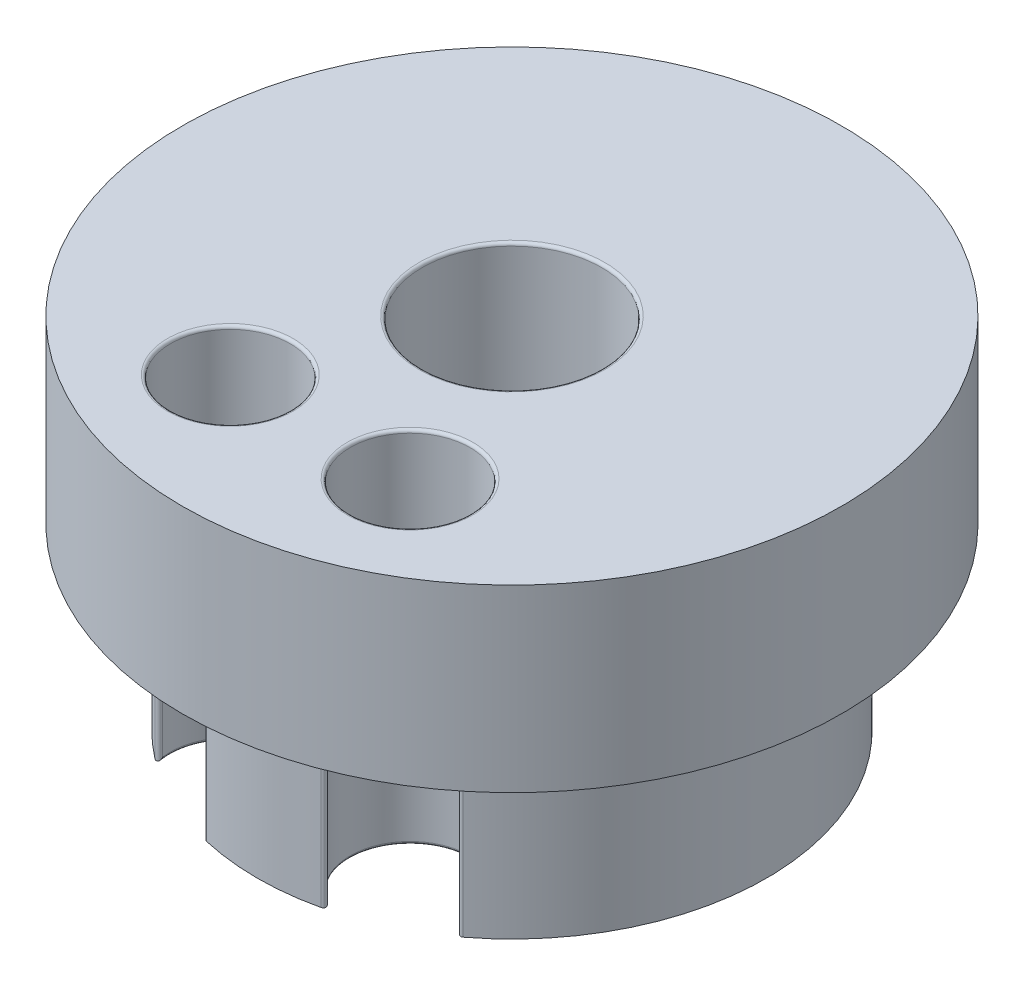
ISO-10303-21;
HEADER;
FILE_DESCRIPTION(('STEP AP214'),'2;1');
FILE_NAME('part.step','',(''),(''),'','','');
FILE_SCHEMA(('AUTOMOTIVE_DESIGN { 1 0 10303 214 1 1 1 1 }'));
ENDSEC;
DATA;
#1=APPLICATION_CONTEXT('core data for automotive mechanical design processes');
#2=APPLICATION_PROTOCOL_DEFINITION('international standard','automotive_design',2000,#1);
#3=PRODUCT_CONTEXT('',#1,'mechanical');
#4=PRODUCT('Part','Part','',(#3));
#5=PRODUCT_RELATED_PRODUCT_CATEGORY('part','',(#4));
#6=PRODUCT_DEFINITION_FORMATION('','',#4);
#7=PRODUCT_DEFINITION_CONTEXT('part definition',#1,'design');
#8=PRODUCT_DEFINITION('design','',#6,#7);
#9=PRODUCT_DEFINITION_SHAPE('','',#8);
#10=(LENGTH_UNIT() NAMED_UNIT(*) SI_UNIT(.MILLI.,.METRE.));
#11=(NAMED_UNIT(*) PLANE_ANGLE_UNIT() SI_UNIT($,.RADIAN.));
#12=(NAMED_UNIT(*) SI_UNIT($,.STERADIAN.) SOLID_ANGLE_UNIT());
#13=UNCERTAINTY_MEASURE_WITH_UNIT(LENGTH_MEASURE(1.E-05),#10,'distance_accuracy_value','');
#14=(GEOMETRIC_REPRESENTATION_CONTEXT(3) GLOBAL_UNCERTAINTY_ASSIGNED_CONTEXT((#13)) GLOBAL_UNIT_ASSIGNED_CONTEXT((#10,
#11,#12)) REPRESENTATION_CONTEXT('',''));
#15=CARTESIAN_POINT('',(0.,0.,0.));
#16=DIRECTION('',(0.,0.,1.));
#17=DIRECTION('',(1.,0.,0.));
#18=AXIS2_PLACEMENT_3D('',#15,#16,#17);
#19=CARTESIAN_POINT('',(0.,-0.6,0.));
#20=DIRECTION('',(0.,1.,0.));
#21=DIRECTION('',(0.,0.,1.));
#22=AXIS2_PLACEMENT_3D('',#19,#20,#21);
#23=CYLINDRICAL_SURFACE('',#22,0.425);
#24=CARTESIAN_POINT('',(0.,-0.3,0.));
#25=DIRECTION('',(0.,-1.,0.));
#26=DIRECTION('',(0.,0.,-1.));
#27=AXIS2_PLACEMENT_3D('',#24,#25,#26);
#28=CIRCLE('',#27,0.425);
#29=CARTESIAN_POINT('',(-0.257018482132162,-0.3,0.338476734566025));
#30=VERTEX_POINT('',#29);
#31=CARTESIAN_POINT('',(0.257018482132162,-0.3,0.338476734566025));
#32=VERTEX_POINT('',#31);
#33=EDGE_CURVE('E314',#30,#32,#28,.T.);
#34=ORIENTED_EDGE('',*,*,#33,.T.);
#35=DIRECTION('',(0.,1.,0.));
#36=VECTOR('',#35,1.);
#37=CARTESIAN_POINT('',(0.257018482132162,-0.6,0.338476734566025));
#38=LINE('',#37,#36);
#39=CARTESIAN_POINT('',(0.257018482132162,-0.6,0.338476734566025));
#40=VERTEX_POINT('',#39);
#41=EDGE_CURVE('E287',#32,#40,#38,.F.);
#42=ORIENTED_EDGE('',*,*,#41,.T.);
#43=CARTESIAN_POINT('',(0.,-0.6,0.));
#44=DIRECTION('',(0.,-1.,0.));
#45=DIRECTION('',(0.,0.,-1.));
#46=AXIS2_PLACEMENT_3D('',#43,#44,#45);
#47=CIRCLE('',#46,0.425);
#48=CARTESIAN_POINT('',(-0.257018482132162,-0.6,0.338476734566025));
#49=VERTEX_POINT('',#48);
#50=EDGE_CURVE('E147',#49,#40,#47,.T.);
#51=ORIENTED_EDGE('',*,*,#50,.F.);
#52=DIRECTION('',(0.,1.,0.));
#53=VECTOR('',#52,1.);
#54=CARTESIAN_POINT('',(-0.257018482132162,-0.6,0.338476734566025));
#55=LINE('',#54,#53);
#56=EDGE_CURVE('E285',#49,#30,#55,.T.);
#57=ORIENTED_EDGE('',*,*,#56,.T.);
#58=EDGE_LOOP('',(#34,#42,#51,#57));
#59=FACE_BOUND('',#58,.T.);
#60=ADVANCED_FACE('F32',(#59),#23,.T.);
#61=CARTESIAN_POINT('',(0.,-0.3,0.));
#62=DIRECTION('',(0.,1.,0.));
#63=DIRECTION('',(0.,0.,1.));
#64=AXIS2_PLACEMENT_3D('',#61,#62,#63);
#65=CYLINDRICAL_SURFACE('',#64,0.55);
#66=CARTESIAN_POINT('',(0.,-0.3,0.));
#67=DIRECTION('',(0.,1.,0.));
#68=DIRECTION('',(0.,0.,1.));
#69=AXIS2_PLACEMENT_3D('',#66,#67,#68);
#70=CIRCLE('',#69,0.55);
#71=CARTESIAN_POINT('',(0.,-0.3,0.55));
#72=VERTEX_POINT('',#71);
#73=EDGE_CURVE('E320',#72,#72,#70,.T.);
#74=ORIENTED_EDGE('',*,*,#73,.T.);
#75=EDGE_LOOP('',(#74));
#76=FACE_BOUND('',#75,.T.);
#77=CARTESIAN_POINT('',(0.,0.,0.));
#78=DIRECTION('',(0.,1.,0.));
#79=DIRECTION('',(0.,0.,1.));
#80=AXIS2_PLACEMENT_3D('',#77,#78,#79);
#81=CIRCLE('',#80,0.55);
#82=CARTESIAN_POINT('',(0.,0.,0.55));
#83=VERTEX_POINT('',#82);
#84=EDGE_CURVE('E146',#83,#83,#81,.T.);
#85=ORIENTED_EDGE('',*,*,#84,.F.);
#86=EDGE_LOOP('',(#85));
#87=FACE_BOUND('',#86,.T.);
#88=ADVANCED_FACE('F344',(#76,#87),#65,.T.);
#89=CARTESIAN_POINT('',(0.,-0.3,0.));
#90=DIRECTION('',(0.,1.,0.));
#91=DIRECTION('',(0.,0.,1.));
#92=AXIS2_PLACEMENT_3D('',#89,#90,#91);
#93=PLANE('',#92);
#94=CARTESIAN_POINT('',(0.0946141518261391,-0.3,0.409204303831497));
#95=DIRECTION('',(0.,1.,0.));
#96=DIRECTION('',(0.,0.,1.));
#97=AXIS2_PLACEMENT_3D('',#94,#95,#96);
#98=CIRCLE('',#97,0.005);
#99=CARTESIAN_POINT('',(0.0957405107764503,-0.3,0.414075783639015));
#100=VERTEX_POINT('',#99);
#101=CARTESIAN_POINT('',(0.098923567361903,-0.3,0.411739838832265));
#102=VERTEX_POINT('',#101);
#103=EDGE_CURVE('E153',#100,#102,#98,.T.);
#104=ORIENTED_EDGE('',*,*,#103,.T.);
#105=CARTESIAN_POINT('',(0.15,-0.3,0.32));
#106=DIRECTION('',(0.,1.,0.));
#107=DIRECTION('',(0.,0.,1.));
#108=AXIS2_PLACEMENT_3D('',#105,#106,#107);
#109=CIRCLE('',#108,0.105);
#110=CARTESIAN_POINT('',(0.253186801406577,-0.3,0.339428947873824));
#111=VERTEX_POINT('',#110);
#112=EDGE_CURVE('E155',#102,#111,#109,.T.);
#113=ORIENTED_EDGE('',*,*,#112,.T.);
#114=CARTESIAN_POINT('',(0.253994735283549,-0.3,0.334494655335836));
#115=DIRECTION('',(0.,1.,0.));
#116=DIRECTION('',(0.,0.,1.));
#117=AXIS2_PLACEMENT_3D('',#114,#115,#116);
#118=CIRCLE('',#117,0.005);
#119=EDGE_CURVE('E174',#111,#32,#118,.T.);
#120=ORIENTED_EDGE('',*,*,#119,.T.);
#121=ORIENTED_EDGE('',*,*,#33,.F.);
#122=CARTESIAN_POINT('',(-0.253994735283549,-0.3,0.334494655335837));
#123=DIRECTION('',(0.,1.,0.));
#124=DIRECTION('',(0.,0.,1.));
#125=AXIS2_PLACEMENT_3D('',#122,#123,#124);
#126=CIRCLE('',#125,0.005);
#127=CARTESIAN_POINT('',(-0.253186801406577,-0.3,0.339428947873824));
#128=VERTEX_POINT('',#127);
#129=EDGE_CURVE('E11',#30,#128,#126,.T.);
#130=ORIENTED_EDGE('',*,*,#129,.T.);
#131=CARTESIAN_POINT('',(-0.15,-0.3,0.32));
#132=DIRECTION('',(0.,1.,0.));
#133=DIRECTION('',(0.,0.,1.));
#134=AXIS2_PLACEMENT_3D('',#131,#132,#133);
#135=CIRCLE('',#134,0.105);
#136=CARTESIAN_POINT('',(-0.0989235673619029,-0.3,0.411739838832265));
#137=VERTEX_POINT('',#136);
#138=EDGE_CURVE('E54',#128,#137,#135,.T.);
#139=ORIENTED_EDGE('',*,*,#138,.T.);
#140=CARTESIAN_POINT('',(-0.0946141518261391,-0.3,0.409204303831497));
#141=DIRECTION('',(0.,1.,0.));
#142=DIRECTION('',(0.,0.,1.));
#143=AXIS2_PLACEMENT_3D('',#140,#141,#142);
#144=CIRCLE('',#143,0.005);
#145=CARTESIAN_POINT('',(-0.0957405107764502,-0.3,0.414075783639015));
#146=VERTEX_POINT('',#145);
#147=EDGE_CURVE('E46',#137,#146,#144,.T.);
#148=ORIENTED_EDGE('',*,*,#147,.T.);
#149=EDGE_CURVE('E312',#100,#146,#28,.T.);
#150=ORIENTED_EDGE('',*,*,#149,.F.);
#151=EDGE_LOOP('',(#104,#113,#120,#121,#130,#139,#148,#150));
#152=FACE_BOUND('',#151,.T.);
#153=ORIENTED_EDGE('',*,*,#73,.F.);
#154=EDGE_LOOP('',(#153));
#155=FACE_BOUND('',#154,.T.);
#156=ADVANCED_FACE('F310',(#152,#155),#93,.F.);
#157=CARTESIAN_POINT('',(0.,0.,0.));
#158=DIRECTION('',(0.,1.,0.));
#159=DIRECTION('',(0.,0.,1.));
#160=AXIS2_PLACEMENT_3D('',#157,#158,#159);
#161=PLANE('',#160);
#162=CARTESIAN_POINT('',(0.,0.,0.));
#163=DIRECTION('',(0.,1.,0.));
#164=DIRECTION('',(0.,0.,1.));
#165=AXIS2_PLACEMENT_3D('',#162,#163,#164);
#166=CIRCLE('',#165,0.155);
#167=CARTESIAN_POINT('',(0.,0.,0.155));
#168=VERTEX_POINT('',#167);
#169=EDGE_CURVE('E334',#168,#168,#166,.F.);
#170=ORIENTED_EDGE('',*,*,#169,.T.);
#171=EDGE_LOOP('',(#170));
#172=FACE_BOUND('',#171,.T.);
#173=CARTESIAN_POINT('',(0.15,0.,0.32));
#174=DIRECTION('',(0.,1.,0.));
#175=DIRECTION('',(0.,0.,1.));
#176=AXIS2_PLACEMENT_3D('',#173,#174,#175);
#177=CIRCLE('',#176,0.105);
#178=CARTESIAN_POINT('',(0.15,0.,0.425));
#179=VERTEX_POINT('',#178);
#180=EDGE_CURVE('E331',#179,#179,#177,.F.);
#181=ORIENTED_EDGE('',*,*,#180,.T.);
#182=EDGE_LOOP('',(#181));
#183=FACE_BOUND('',#182,.T.);
#184=CARTESIAN_POINT('',(-0.15,0.,0.32));
#185=DIRECTION('',(0.,1.,0.));
#186=DIRECTION('',(0.,0.,1.));
#187=AXIS2_PLACEMENT_3D('',#184,#185,#186);
#188=CIRCLE('',#187,0.105);
#189=CARTESIAN_POINT('',(-0.15,0.,0.425));
#190=VERTEX_POINT('',#189);
#191=EDGE_CURVE('E328',#190,#190,#188,.F.);
#192=ORIENTED_EDGE('',*,*,#191,.T.);
#193=EDGE_LOOP('',(#192));
#194=FACE_BOUND('',#193,.T.);
#195=ORIENTED_EDGE('',*,*,#84,.T.);
#196=EDGE_LOOP('',(#195));
#197=FACE_BOUND('',#196,.T.);
#198=ADVANCED_FACE('F354',(#172,#183,#194,#197),#161,.T.);
#199=CARTESIAN_POINT('',(0.0957405107764503,-0.6,0.414075783639015));
#200=VERTEX_POINT('',#199);
#201=CARTESIAN_POINT('',(-0.0957405107764502,-0.6,0.414075783639015));
#202=VERTEX_POINT('',#201);
#203=EDGE_CURVE('E129',#200,#202,#47,.T.);
#204=ORIENTED_EDGE('',*,*,#203,.F.);
#205=DIRECTION('',(0.,1.,0.));
#206=VECTOR('',#205,1.);
#207=CARTESIAN_POINT('',(0.0957405107764503,-0.6,0.414075783639015));
#208=LINE('',#207,#206);
#209=EDGE_CURVE('E142',#200,#100,#208,.T.);
#210=ORIENTED_EDGE('',*,*,#209,.T.);
#211=ORIENTED_EDGE('',*,*,#149,.T.);
#212=DIRECTION('',(0.,1.,0.));
#213=VECTOR('',#212,1.);
#214=CARTESIAN_POINT('',(-0.0957405107764503,-0.6,0.414075783639015));
#215=LINE('',#214,#213);
#216=EDGE_CURVE('E145',#146,#202,#215,.F.);
#217=ORIENTED_EDGE('',*,*,#216,.T.);
#218=EDGE_LOOP('',(#204,#210,#211,#217));
#219=FACE_BOUND('',#218,.T.);
#220=ADVANCED_FACE('F140',(#219),#23,.T.);
#221=CARTESIAN_POINT('',(0.,-0.6,0.));
#222=DIRECTION('',(0.,-1.,0.));
#223=DIRECTION('',(0.,0.,-1.));
#224=AXIS2_PLACEMENT_3D('',#221,#222,#223);
#225=PLANE('',#224);
#226=CARTESIAN_POINT('',(0.,-0.6,0.));
#227=DIRECTION('',(0.,-1.,0.));
#228=DIRECTION('',(0.,0.,-1.));
#229=AXIS2_PLACEMENT_3D('',#226,#227,#228);
#230=CIRCLE('',#229,0.155);
#231=CARTESIAN_POINT('',(0.,-0.6,-0.155));
#232=VERTEX_POINT('',#231);
#233=EDGE_CURVE('E282',#232,#232,#230,.F.);
#234=ORIENTED_EDGE('',*,*,#233,.T.);
#235=EDGE_LOOP('',(#234));
#236=FACE_BOUND('',#235,.T.);
#237=ORIENTED_EDGE('',*,*,#50,.T.);
#238=CARTESIAN_POINT('',(0.253994735283549,-0.6,0.334494655335836));
#239=DIRECTION('',(0.,-1.,0.));
#240=DIRECTION('',(0.,0.,-1.));
#241=AXIS2_PLACEMENT_3D('',#238,#239,#240);
#242=CIRCLE('',#241,0.005);
#243=CARTESIAN_POINT('',(0.253186801406558,-0.6,0.339428947873821));
#244=VERTEX_POINT('',#243);
#245=EDGE_CURVE('E280',#40,#244,#242,.T.);
#246=ORIENTED_EDGE('',*,*,#245,.T.);
#247=CARTESIAN_POINT('',(0.15,-0.6,0.32));
#248=DIRECTION('',(0.,-1.,0.));
#249=DIRECTION('',(0.,0.,-1.));
#250=AXIS2_PLACEMENT_3D('',#247,#248,#249);
#251=CIRCLE('',#250,0.105);
#252=CARTESIAN_POINT('',(0.0989235673619124,-0.6,0.411739838832248));
#253=VERTEX_POINT('',#252);
#254=EDGE_CURVE('E131',#244,#253,#251,.F.);
#255=ORIENTED_EDGE('',*,*,#254,.T.);
#256=CARTESIAN_POINT('',(0.0946141518261391,-0.6,0.409204303831497));
#257=DIRECTION('',(0.,-1.,0.));
#258=DIRECTION('',(0.,0.,-1.));
#259=AXIS2_PLACEMENT_3D('',#256,#257,#258);
#260=CIRCLE('',#259,0.005);
#261=EDGE_CURVE('E125',#253,#200,#260,.T.);
#262=ORIENTED_EDGE('',*,*,#261,.T.);
#263=ORIENTED_EDGE('',*,*,#203,.T.);
#264=CARTESIAN_POINT('',(-0.0946141518261391,-0.6,0.409204303831497));
#265=DIRECTION('',(0.,-1.,0.));
#266=DIRECTION('',(0.,0.,-1.));
#267=AXIS2_PLACEMENT_3D('',#264,#265,#266);
#268=CIRCLE('',#267,0.005);
#269=CARTESIAN_POINT('',(-0.0989235673619123,-0.6,0.411739838832248));
#270=VERTEX_POINT('',#269);
#271=EDGE_CURVE('E136',#202,#270,#268,.T.);
#272=ORIENTED_EDGE('',*,*,#271,.T.);
#273=CARTESIAN_POINT('',(-0.15,-0.6,0.32));
#274=DIRECTION('',(0.,-1.,0.));
#275=DIRECTION('',(0.,0.,-1.));
#276=AXIS2_PLACEMENT_3D('',#273,#274,#275);
#277=CIRCLE('',#276,0.105);
#278=CARTESIAN_POINT('',(-0.253186801406558,-0.6,0.339428947873821));
#279=VERTEX_POINT('',#278);
#280=EDGE_CURVE('E273',#270,#279,#277,.F.);
#281=ORIENTED_EDGE('',*,*,#280,.T.);
#282=CARTESIAN_POINT('',(-0.253994735283549,-0.6,0.334494655335837));
#283=DIRECTION('',(0.,-1.,0.));
#284=DIRECTION('',(0.,0.,-1.));
#285=AXIS2_PLACEMENT_3D('',#282,#283,#284);
#286=CIRCLE('',#285,0.005);
#287=EDGE_CURVE('E275',#279,#49,#286,.T.);
#288=ORIENTED_EDGE('',*,*,#287,.T.);
#289=EDGE_LOOP('',(#237,#246,#255,#262,#263,#272,#281,#288));
#290=FACE_BOUND('',#289,.T.);
#291=ADVANCED_FACE('F128',(#236,#290),#225,.T.);
#292=CARTESIAN_POINT('',(-0.15,-0.6,0.32));
#293=DIRECTION('',(0.,1.,0.));
#294=DIRECTION('',(0.,0.,1.));
#295=AXIS2_PLACEMENT_3D('',#292,#293,#294);
#296=CYLINDRICAL_SURFACE('',#295,0.1);
#297=CARTESIAN_POINT('',(-0.15,-0.595,0.32));
#298=DIRECTION('',(0.,-1.,0.));
#299=DIRECTION('',(0.,0.,-1.));
#300=AXIS2_PLACEMENT_3D('',#297,#298,#299);
#301=CIRCLE('',#300,0.1);
#302=CARTESIAN_POINT('',(-0.249042605031951,-0.595,0.333804433653178));
#303=VERTEX_POINT('',#302);
#304=CARTESIAN_POINT('',(-0.0972515731677516,-0.595,0.404956479839521));
#305=VERTEX_POINT('',#304);
#306=EDGE_CURVE('E169',#303,#305,#301,.T.);
#307=ORIENTED_EDGE('',*,*,#306,.T.);
#308=DIRECTION('',(0.,1.,0.));
#309=VECTOR('',#308,1.);
#310=CARTESIAN_POINT('',(-0.0972515731677516,-0.6,0.404956479839521));
#311=LINE('',#310,#309);
#312=CARTESIAN_POINT('',(-0.0972515731677516,-0.295,0.404956479839521));
#313=VERTEX_POINT('',#312);
#314=EDGE_CURVE('E171',#305,#313,#311,.T.);
#315=ORIENTED_EDGE('',*,*,#314,.T.);
#316=CARTESIAN_POINT('',(-0.15,-0.295,0.32));
#317=DIRECTION('',(0.,1.,0.));
#318=DIRECTION('',(0.,0.,1.));
#319=AXIS2_PLACEMENT_3D('',#316,#317,#318);
#320=CIRCLE('',#319,0.1);
#321=CARTESIAN_POINT('',(-0.249042605031951,-0.295,0.333804433653178));
#322=VERTEX_POINT('',#321);
#323=EDGE_CURVE('E165',#313,#322,#320,.F.);
#324=ORIENTED_EDGE('',*,*,#323,.T.);
#325=DIRECTION('',(0.,1.,0.));
#326=VECTOR('',#325,1.);
#327=CARTESIAN_POINT('',(-0.249042605031951,-0.6,0.333804433653178));
#328=LINE('',#327,#326);
#329=EDGE_CURVE('E167',#322,#303,#328,.F.);
#330=ORIENTED_EDGE('',*,*,#329,.T.);
#331=EDGE_LOOP('',(#307,#315,#324,#330));
#332=FACE_BOUND('',#331,.T.);
#333=CARTESIAN_POINT('',(-0.15,-0.00500000000000001,0.32));
#334=DIRECTION('',(0.,1.,0.));
#335=DIRECTION('',(0.,0.,1.));
#336=AXIS2_PLACEMENT_3D('',#333,#334,#335);
#337=CIRCLE('',#336,0.1);
#338=CARTESIAN_POINT('',(-0.15,-0.00500000000000001,0.42));
#339=VERTEX_POINT('',#338);
#340=EDGE_CURVE('E162',#339,#339,#337,.T.);
#341=ORIENTED_EDGE('',*,*,#340,.T.);
#342=EDGE_LOOP('',(#341));
#343=FACE_BOUND('',#342,.T.);
#344=ADVANCED_FACE('F271',(#332,#343),#296,.F.);
#345=CARTESIAN_POINT('',(0.15,-0.6,0.32));
#346=DIRECTION('',(0.,1.,0.));
#347=DIRECTION('',(0.,0.,1.));
#348=AXIS2_PLACEMENT_3D('',#345,#346,#347);
#349=CYLINDRICAL_SURFACE('',#348,0.1);
#350=CARTESIAN_POINT('',(0.15,-0.595,0.32));
#351=DIRECTION('',(0.,-1.,0.));
#352=DIRECTION('',(0.,0.,-1.));
#353=AXIS2_PLACEMENT_3D('',#350,#351,#352);
#354=CIRCLE('',#353,0.1);
#355=CARTESIAN_POINT('',(0.0972515731677516,-0.595,0.404956479839521));
#356=VERTEX_POINT('',#355);
#357=CARTESIAN_POINT('',(0.249042605031951,-0.595,0.333804433653178));
#358=VERTEX_POINT('',#357);
#359=EDGE_CURVE('E297',#356,#358,#354,.T.);
#360=ORIENTED_EDGE('',*,*,#359,.T.);
#361=DIRECTION('',(0.,1.,0.));
#362=VECTOR('',#361,1.);
#363=CARTESIAN_POINT('',(0.249042605031951,-0.6,0.333804433653178));
#364=LINE('',#363,#362);
#365=CARTESIAN_POINT('',(0.249042605031951,-0.295,0.333804433653178));
#366=VERTEX_POINT('',#365);
#367=EDGE_CURVE('E157',#358,#366,#364,.T.);
#368=ORIENTED_EDGE('',*,*,#367,.T.);
#369=CARTESIAN_POINT('',(0.15,-0.295,0.32));
#370=DIRECTION('',(0.,1.,0.));
#371=DIRECTION('',(0.,0.,1.));
#372=AXIS2_PLACEMENT_3D('',#369,#370,#371);
#373=CIRCLE('',#372,0.1);
#374=CARTESIAN_POINT('',(0.0972515731677516,-0.295,0.404956479839521));
#375=VERTEX_POINT('',#374);
#376=EDGE_CURVE('E293',#366,#375,#373,.F.);
#377=ORIENTED_EDGE('',*,*,#376,.T.);
#378=DIRECTION('',(0.,1.,0.));
#379=VECTOR('',#378,1.);
#380=CARTESIAN_POINT('',(0.0972515731677516,-0.6,0.404956479839521));
#381=LINE('',#380,#379);
#382=EDGE_CURVE('E295',#375,#356,#381,.F.);
#383=ORIENTED_EDGE('',*,*,#382,.T.);
#384=EDGE_LOOP('',(#360,#368,#377,#383));
#385=FACE_BOUND('',#384,.T.);
#386=CARTESIAN_POINT('',(0.15,-0.00500000000000001,0.32));
#387=DIRECTION('',(0.,1.,0.));
#388=DIRECTION('',(0.,0.,1.));
#389=AXIS2_PLACEMENT_3D('',#386,#387,#388);
#390=CIRCLE('',#389,0.1);
#391=CARTESIAN_POINT('',(0.15,-0.00500000000000001,0.42));
#392=VERTEX_POINT('',#391);
#393=EDGE_CURVE('E290',#392,#392,#390,.T.);
#394=ORIENTED_EDGE('',*,*,#393,.T.);
#395=EDGE_LOOP('',(#394));
#396=FACE_BOUND('',#395,.T.);
#397=ADVANCED_FACE('F301',(#385,#396),#349,.F.);
#398=CARTESIAN_POINT('',(0.,-0.6,0.));
#399=DIRECTION('',(0.,1.,0.));
#400=DIRECTION('',(0.,0.,1.));
#401=AXIS2_PLACEMENT_3D('',#398,#399,#400);
#402=CYLINDRICAL_SURFACE('',#401,0.15);
#403=CARTESIAN_POINT('',(0.,-0.00500000000000001,0.));
#404=DIRECTION('',(0.,1.,0.));
#405=DIRECTION('',(0.,0.,1.));
#406=AXIS2_PLACEMENT_3D('',#403,#404,#405);
#407=CIRCLE('',#406,0.15);
#408=CARTESIAN_POINT('',(0.,-0.00500000000000001,0.15));
#409=VERTEX_POINT('',#408);
#410=EDGE_CURVE('E317',#409,#409,#407,.T.);
#411=ORIENTED_EDGE('',*,*,#410,.T.);
#412=EDGE_LOOP('',(#411));
#413=FACE_BOUND('',#412,.T.);
#414=CARTESIAN_POINT('',(0.,-0.595,0.));
#415=DIRECTION('',(0.,-1.,0.));
#416=DIRECTION('',(0.,0.,-1.));
#417=AXIS2_PLACEMENT_3D('',#414,#415,#416);
#418=CIRCLE('',#417,0.15);
#419=CARTESIAN_POINT('',(0.,-0.595,-0.15));
#420=VERTEX_POINT('',#419);
#421=EDGE_CURVE('E313',#420,#420,#418,.T.);
#422=ORIENTED_EDGE('',*,*,#421,.T.);
#423=EDGE_LOOP('',(#422));
#424=FACE_BOUND('',#423,.T.);
#425=ADVANCED_FACE('F370',(#413,#424),#402,.F.);
#426=CARTESIAN_POINT('',(0.,-0.00500000000000001,0.));
#427=DIRECTION('',(0.,1.,0.));
#428=DIRECTION('',(0.,0.,1.));
#429=AXIS2_PLACEMENT_3D('',#426,#427,#428);
#430=TOROIDAL_SURFACE('',#429,0.155,0.005);
#431=ORIENTED_EDGE('',*,*,#169,.F.);
#432=EDGE_LOOP('',(#431));
#433=FACE_BOUND('',#432,.T.);
#434=ORIENTED_EDGE('',*,*,#410,.F.);
#435=EDGE_LOOP('',(#434));
#436=FACE_BOUND('',#435,.T.);
#437=ADVANCED_FACE('F367',(#433,#436),#430,.T.);
#438=CARTESIAN_POINT('',(0.,-0.595,0.));
#439=DIRECTION('',(0.,-1.,0.));
#440=DIRECTION('',(0.,0.,-1.));
#441=AXIS2_PLACEMENT_3D('',#438,#439,#440);
#442=TOROIDAL_SURFACE('',#441,0.155,0.005);
#443=ORIENTED_EDGE('',*,*,#421,.F.);
#444=EDGE_LOOP('',(#443));
#445=FACE_BOUND('',#444,.T.);
#446=ORIENTED_EDGE('',*,*,#233,.F.);
#447=EDGE_LOOP('',(#446));
#448=FACE_BOUND('',#447,.T.);
#449=ADVANCED_FACE('F369',(#445,#448),#442,.T.);
#450=CARTESIAN_POINT('',(0.0946141518261391,-0.6,0.409204303831497));
#451=DIRECTION('',(0.,-1.,0.));
#452=DIRECTION('',(0.,0.,-1.));
#453=AXIS2_PLACEMENT_3D('',#450,#451,#452);
#454=CYLINDRICAL_SURFACE('',#453,0.005);
#455=CARTESIAN_POINT('',(0.098923567361903,-0.6,0.411739838832265));
#456=CARTESIAN_POINT('',(0.099037109724336,-0.600000392207745,0.41154761418431));
#457=CARTESIAN_POINT('',(0.0991368599285213,-0.599985084665027,0.411347891269276));
#458=CARTESIAN_POINT('',(0.0993073404714314,-0.599926125869547,0.410942374430836));
#459=CARTESIAN_POINT('',(0.0993783130137966,-0.599882719515652,0.410736647493203));
#460=CARTESIAN_POINT('',(0.0994916343712273,-0.599770669306673,0.410325015866583));
#461=CARTESIAN_POINT('',(0.0995340549529624,-0.599702089402815,0.410119112935657));
#462=CARTESIAN_POINT('',(0.0995926308857317,-0.599543810960538,0.409711475896804));
#463=CARTESIAN_POINT('',(0.0996087287442989,-0.599454066683705,0.409509751861701));
#464=CARTESIAN_POINT('',(0.0996189923593554,-0.599217525606701,0.409033654994556));
#465=CARTESIAN_POINT('',(0.0996015434437092,-0.599062384425994,0.408763186286473));
#466=CARTESIAN_POINT('',(0.0995279521952226,-0.598728172883134,0.408243138129451));
#467=CARTESIAN_POINT('',(0.0994717281722598,-0.598549052645966,0.407993604032138));
#468=CARTESIAN_POINT('',(0.0992981812602483,-0.598097695535768,0.407420327794458));
#469=CARTESIAN_POINT('',(0.0991652956140825,-0.597817262238015,0.407107793735733));
#470=CARTESIAN_POINT('',(0.0988511052001073,-0.597237087976618,0.406529090077766));
#471=CARTESIAN_POINT('',(0.0986697675598422,-0.596937334009943,0.406262952159506));
#472=CARTESIAN_POINT('',(0.0983272725329193,-0.596417232709087,0.405848398224909));
#473=CARTESIAN_POINT('',(0.0981758921381277,-0.596199489579907,0.405688391991599));
#474=CARTESIAN_POINT('',(0.0978561428176769,-0.595761317549946,0.405391556833281));
#475=CARTESIAN_POINT('',(0.0976878009922906,-0.595540893413182,0.405254691842708));
#476=CARTESIAN_POINT('',(0.0974268034582191,-0.595213424714666,0.405069112014762));
#477=CARTESIAN_POINT('',(0.0973400306121169,-0.595106699264835,0.405011415097238));
#478=CARTESIAN_POINT('',(0.0972515731677516,-0.595,0.404956479839521));
#479=B_SPLINE_CURVE_WITH_KNOTS('',3,(#455,#456,#457,#458,#459,#460,#461,#462,#463,#464,#465,
#466,#467,#468,#469,#470,#471,#472,#473,#474,#475,#476,#477,#478),.UNSPECIFIED.,.F.,.F.,(4,2,2,
2,2,2,2,2,2,2,2,4),(0.,0.000667863385239556,0.00132998289287641,0.00199043185464555,
0.00265232141076456,0.00358401008673457,0.00451766763406952,0.00583187130905368,
0.00714696888499545,0.00807488231615759,0.00900133599344971,0.00944865621162361),.UNSPECIFIED.);
#480=EDGE_CURVE('E219',#356,#253,#479,.F.);
#481=ORIENTED_EDGE('',*,*,#480,.F.);
#482=ORIENTED_EDGE('',*,*,#382,.F.);
#483=CARTESIAN_POINT('',(0.098923567361903,-0.3,0.411739838832265));
#484=CARTESIAN_POINT('',(0.0990371097243361,-0.300000392207745,0.41154761418431));
#485=CARTESIAN_POINT('',(0.0991368599285214,-0.299985084665027,0.411347891269276));
#486=CARTESIAN_POINT('',(0.0993073404714315,-0.299926125869547,0.410942374430836));
#487=CARTESIAN_POINT('',(0.0993783130137966,-0.299882719515652,0.410736647493203));
#488=CARTESIAN_POINT('',(0.0994916343712273,-0.299770669306673,0.410325015866583));
#489=CARTESIAN_POINT('',(0.0995340549529624,-0.299702089402815,0.410119112935657));
#490=CARTESIAN_POINT('',(0.0995926308857317,-0.299543810960538,0.409711475896804));
#491=CARTESIAN_POINT('',(0.0996087287442989,-0.299454066683705,0.409509751861701));
#492=CARTESIAN_POINT('',(0.0996189923593554,-0.299217525606701,0.409033654994556));
#493=CARTESIAN_POINT('',(0.0996015434437092,-0.299062384425994,0.408763186286473));
#494=CARTESIAN_POINT('',(0.0995279521952226,-0.298728172883135,0.408243138129451));
#495=CARTESIAN_POINT('',(0.0994717281722598,-0.298549052645966,0.407993604032138));
#496=CARTESIAN_POINT('',(0.0992981812602483,-0.298097695535768,0.407420327794458));
#497=CARTESIAN_POINT('',(0.0991652956140825,-0.297817262238015,0.407107793735733));
#498=CARTESIAN_POINT('',(0.0988511052001073,-0.297237087976618,0.406529090077766));
#499=CARTESIAN_POINT('',(0.0986697675598421,-0.296937334009943,0.406262952159506));
#500=CARTESIAN_POINT('',(0.0983272725329193,-0.296417232709087,0.405848398224909));
#501=CARTESIAN_POINT('',(0.0981758921381277,-0.296199489579907,0.405688391991599));
#502=CARTESIAN_POINT('',(0.0978561428176769,-0.295761317549946,0.405391556833281));
#503=CARTESIAN_POINT('',(0.0976878009922905,-0.295540893413182,0.405254691842708));
#504=CARTESIAN_POINT('',(0.097426803458219,-0.295213424714667,0.405069112014761));
#505=CARTESIAN_POINT('',(0.0973400306121169,-0.295106699264835,0.405011415097238));
#506=CARTESIAN_POINT('',(0.0972515731677516,-0.295,0.404956479839521));
#507=B_SPLINE_CURVE_WITH_KNOTS('',3,(#483,#484,#485,#486,#487,#488,#489,#490,#491,#492,#493,
#494,#495,#496,#497,#498,#499,#500,#501,#502,#503,#504,#505,#506),.UNSPECIFIED.,.F.,.F.,(4,2,2,
2,2,2,2,2,2,2,2,4),(0.,0.000667863385239623,0.00132998289287642,0.00199043185464557,
0.00265232141076458,0.00358401008673457,0.00451766763406952,0.00583187130905368,
0.00714696888499546,0.00807488231615751,0.00900133599344964,0.0094486562116236),.UNSPECIFIED.);
#508=EDGE_CURVE('E212',#102,#375,#507,.T.);
#509=ORIENTED_EDGE('',*,*,#508,.F.);
#510=ORIENTED_EDGE('',*,*,#103,.F.);
#511=ORIENTED_EDGE('',*,*,#209,.F.);
#512=ORIENTED_EDGE('',*,*,#261,.F.);
#513=EDGE_LOOP('',(#481,#482,#509,#510,#511,#512));
#514=FACE_BOUND('',#513,.T.);
#515=ADVANCED_FACE('F150',(#514),#454,.T.);
#516=CARTESIAN_POINT('',(0.15,-0.295,0.32));
#517=DIRECTION('',(0.,1.,0.));
#518=DIRECTION('',(0.,0.,1.));
#519=AXIS2_PLACEMENT_3D('',#516,#517,#518);
#520=TOROIDAL_SURFACE('',#519,0.105,0.005);
#521=ORIENTED_EDGE('',*,*,#508,.T.);
#522=ORIENTED_EDGE('',*,*,#376,.F.);
#523=CARTESIAN_POINT('',(0.253186801406577,-0.3,0.339428947873824));
#524=CARTESIAN_POINT('',(0.252966420293989,-0.300000392207745,0.339393249854785));
#525=CARTESIAN_POINT('',(0.252749098907619,-0.299985084665027,0.339342154247824));
#526=CARTESIAN_POINT('',(0.252328354216917,-0.299926125869547,0.33921377423764));
#527=CARTESIAN_POINT('',(0.252124827458328,-0.299882719515652,0.339136718847329));
#528=CARTESIAN_POINT('',(0.25173594825405,-0.299770669306673,0.338960493734009));
#529=CARTESIAN_POINT('',(0.251550551249651,-0.299702089402815,0.338861380296584));
#530=CARTESIAN_POINT('',(0.251199763637496,-0.299543810960538,0.338645632419415));
#531=CARTESIAN_POINT('',(0.251034417550471,-0.299454066683705,0.338528960233808));
#532=CARTESIAN_POINT('',(0.250661916653041,-0.299217525606701,0.338232284231891));
#533=CARTESIAN_POINT('',(0.250465192652915,-0.299062384425994,0.338045850719658));
#534=CARTESIAN_POINT('',(0.250112553082698,-0.298728172883135,0.337656606463447));
#535=CARTESIAN_POINT('',(0.249956724628677,-0.298549052645966,0.337453761943193));
#536=CARTESIAN_POINT('',(0.249627115977375,-0.298097695535768,0.336953639645805));
#537=CARTESIAN_POINT('',(0.249471906157447,-0.297817262238015,0.33665157004353));
#538=CARTESIAN_POINT('',(0.249228097213587,-0.297237087976618,0.336039875071448));
#539=CARTESIAN_POINT('',(0.249139543469025,-0.296937334009943,0.335730244702076));
#540=CARTESIAN_POINT('',(0.249040009241081,-0.296417232709087,0.335201802892958));
#541=CARTESIAN_POINT('',(0.249013865887567,-0.296199489579907,0.334983091796549));
#542=CARTESIAN_POINT('',(0.248990261367995,-0.295761317549946,0.33454743876282));
#543=CARTESIAN_POINT('',(0.248992755145044,-0.295540893413182,0.334330494583605));
#544=CARTESIAN_POINT('',(0.249017078919979,-0.295213424714667,0.334011170392061));
#545=CARTESIAN_POINT('',(0.249028241820871,-0.295106699264835,0.333907566093135));
#546=CARTESIAN_POINT('',(0.249042605031951,-0.295,0.333804433653178));
#547=B_SPLINE_CURVE_WITH_KNOTS('',3,(#523,#524,#525,#526,#527,#528,#529,#530,#531,#532,#533,
#534,#535,#536,#537,#538,#539,#540,#541,#542,#543,#544,#545,#546),.UNSPECIFIED.,.F.,.F.,(4,2,2,
2,2,2,2,2,2,2,2,4),(0.,0.000667863385239624,0.00132998289287643,0.00199043185464556,
0.00265232141076455,0.00358401008673456,0.00451766763406955,0.00583187130905373,
0.0071469688849955,0.00807488231615751,0.00900133599344964,0.00944865621162361),.UNSPECIFIED.);
#548=EDGE_CURVE('E187',#111,#366,#547,.T.);
#549=ORIENTED_EDGE('',*,*,#548,.F.);
#550=ORIENTED_EDGE('',*,*,#112,.F.);
#551=EDGE_LOOP('',(#521,#522,#549,#550));
#552=FACE_BOUND('',#551,.T.);
#553=ADVANCED_FACE('F202',(#552),#520,.T.);
#554=CARTESIAN_POINT('',(0.15,-0.595,0.32));
#555=DIRECTION('',(0.,-1.,0.));
#556=DIRECTION('',(0.,0.,-1.));
#557=AXIS2_PLACEMENT_3D('',#554,#555,#556);
#558=TOROIDAL_SURFACE('',#557,0.105,0.005);
#559=ORIENTED_EDGE('',*,*,#480,.T.);
#560=ORIENTED_EDGE('',*,*,#254,.F.);
#561=CARTESIAN_POINT('',(0.253186801406577,-0.6,0.339428947873824));
#562=CARTESIAN_POINT('',(0.252966420293989,-0.600000392207745,0.339393249854785));
#563=CARTESIAN_POINT('',(0.252749098907619,-0.599985084665027,0.339342154247824));
#564=CARTESIAN_POINT('',(0.252328354216917,-0.599926125869547,0.33921377423764));
#565=CARTESIAN_POINT('',(0.252124827458328,-0.599882719515652,0.339136718847329));
#566=CARTESIAN_POINT('',(0.25173594825405,-0.599770669306673,0.338960493734009));
#567=CARTESIAN_POINT('',(0.251550551249651,-0.599702089402815,0.338861380296584));
#568=CARTESIAN_POINT('',(0.251199763637496,-0.599543810960538,0.338645632419415));
#569=CARTESIAN_POINT('',(0.251034417550471,-0.599454066683705,0.338528960233808));
#570=CARTESIAN_POINT('',(0.250661916653041,-0.599217525606701,0.338232284231891));
#571=CARTESIAN_POINT('',(0.250465192652915,-0.599062384425994,0.338045850719658));
#572=CARTESIAN_POINT('',(0.250112553082698,-0.598728172883134,0.337656606463447));
#573=CARTESIAN_POINT('',(0.249956724628677,-0.598549052645966,0.337453761943193));
#574=CARTESIAN_POINT('',(0.249627115977375,-0.598097695535768,0.336953639645805));
#575=CARTESIAN_POINT('',(0.249471906157447,-0.597817262238015,0.33665157004353));
#576=CARTESIAN_POINT('',(0.249228097213587,-0.597237087976618,0.336039875071448));
#577=CARTESIAN_POINT('',(0.249139543469025,-0.596937334009943,0.335730244702076));
#578=CARTESIAN_POINT('',(0.249040009241081,-0.596417232709087,0.335201802892958));
#579=CARTESIAN_POINT('',(0.249013865887567,-0.596199489579907,0.334983091796549));
#580=CARTESIAN_POINT('',(0.248990261367995,-0.595761317549946,0.33454743876282));
#581=CARTESIAN_POINT('',(0.248992755145044,-0.595540893413182,0.334330494583605));
#582=CARTESIAN_POINT('',(0.249017078919979,-0.595213424714667,0.334011170392061));
#583=CARTESIAN_POINT('',(0.249028241820871,-0.595106699264835,0.333907566093135));
#584=CARTESIAN_POINT('',(0.249042605031951,-0.595,0.333804433653178));
#585=B_SPLINE_CURVE_WITH_KNOTS('',3,(#561,#562,#563,#564,#565,#566,#567,#568,#569,#570,#571,
#572,#573,#574,#575,#576,#577,#578,#579,#580,#581,#582,#583,#584),.UNSPECIFIED.,.F.,.F.,(4,2,2,
2,2,2,2,2,2,2,2,4),(0.,0.000667863385239624,0.00132998289287643,0.00199043185464554,
0.00265232141076453,0.0035840100867345,0.00451766763406956,0.00583187130905385,
0.00714696888499551,0.00807488231615762,0.00900133599344971,0.00944865621162361),.UNSPECIFIED.);
#586=EDGE_CURVE('E178',#358,#244,#585,.F.);
#587=ORIENTED_EDGE('',*,*,#586,.F.);
#588=ORIENTED_EDGE('',*,*,#359,.F.);
#589=EDGE_LOOP('',(#559,#560,#587,#588));
#590=FACE_BOUND('',#589,.T.);
#591=ADVANCED_FACE('F194',(#590),#558,.T.);
#592=CARTESIAN_POINT('',(0.253994735283549,-0.6,0.334494655335836));
#593=DIRECTION('',(0.,1.,0.));
#594=DIRECTION('',(0.,0.,1.));
#595=AXIS2_PLACEMENT_3D('',#592,#593,#594);
#596=CYLINDRICAL_SURFACE('',#595,0.005);
#597=ORIENTED_EDGE('',*,*,#548,.T.);
#598=ORIENTED_EDGE('',*,*,#367,.F.);
#599=ORIENTED_EDGE('',*,*,#586,.T.);
#600=ORIENTED_EDGE('',*,*,#245,.F.);
#601=ORIENTED_EDGE('',*,*,#41,.F.);
#602=ORIENTED_EDGE('',*,*,#119,.F.);
#603=EDGE_LOOP('',(#597,#598,#599,#600,#601,#602));
#604=FACE_BOUND('',#603,.T.);
#605=ADVANCED_FACE('F197',(#604),#596,.T.);
#606=CARTESIAN_POINT('',(0.15,-0.00500000000000001,0.32));
#607=DIRECTION('',(0.,1.,0.));
#608=DIRECTION('',(0.,0.,1.));
#609=AXIS2_PLACEMENT_3D('',#606,#607,#608);
#610=TOROIDAL_SURFACE('',#609,0.105,0.005);
#611=ORIENTED_EDGE('',*,*,#180,.F.);
#612=EDGE_LOOP('',(#611));
#613=FACE_BOUND('',#612,.T.);
#614=ORIENTED_EDGE('',*,*,#393,.F.);
#615=EDGE_LOOP('',(#614));
#616=FACE_BOUND('',#615,.T.);
#617=ADVANCED_FACE('F200',(#613,#616),#610,.T.);
#618=CARTESIAN_POINT('',(-0.253994735283549,-0.6,0.334494655335837));
#619=DIRECTION('',(0.,-1.,0.));
#620=DIRECTION('',(0.,0.,-1.));
#621=AXIS2_PLACEMENT_3D('',#618,#619,#620);
#622=CYLINDRICAL_SURFACE('',#621,0.005);
#623=CARTESIAN_POINT('',(-0.253186801406577,-0.6,0.339428947873824));
#624=CARTESIAN_POINT('',(-0.252966420293989,-0.600000392207745,0.339393249854785));
#625=CARTESIAN_POINT('',(-0.252749098907619,-0.599985084665027,0.339342154247824));
#626=CARTESIAN_POINT('',(-0.252328354216917,-0.599926125869547,0.33921377423764));
#627=CARTESIAN_POINT('',(-0.252124827458328,-0.599882719515652,0.339136718847329));
#628=CARTESIAN_POINT('',(-0.25173594825405,-0.599770669306673,0.338960493734009));
#629=CARTESIAN_POINT('',(-0.251550551249651,-0.599702089402815,0.338861380296584));
#630=CARTESIAN_POINT('',(-0.251199763637496,-0.599543810960538,0.338645632419414));
#631=CARTESIAN_POINT('',(-0.251034417550471,-0.599454066683705,0.338528960233808));
#632=CARTESIAN_POINT('',(-0.250661916653041,-0.599217525606701,0.338232284231891));
#633=CARTESIAN_POINT('',(-0.250465192652915,-0.599062384425994,0.338045850719658));
#634=CARTESIAN_POINT('',(-0.250112553082698,-0.598728172883134,0.337656606463447));
#635=CARTESIAN_POINT('',(-0.249956724628676,-0.598549052645966,0.337453761943193));
#636=CARTESIAN_POINT('',(-0.249627115977375,-0.598097695535768,0.336953639645805));
#637=CARTESIAN_POINT('',(-0.249471906157447,-0.597817262238015,0.33665157004353));
#638=CARTESIAN_POINT('',(-0.249228097213587,-0.597237087976618,0.336039875071448));
#639=CARTESIAN_POINT('',(-0.249139543469024,-0.596937334009943,0.335730244702076));
#640=CARTESIAN_POINT('',(-0.249040009241081,-0.596417232709087,0.335201802892958));
#641=CARTESIAN_POINT('',(-0.249013865887567,-0.596199489579907,0.334983091796549));
#642=CARTESIAN_POINT('',(-0.248990261367995,-0.595761317549947,0.334547438762819));
#643=CARTESIAN_POINT('',(-0.248992755145044,-0.595540893413183,0.334330494583604));
#644=CARTESIAN_POINT('',(-0.249017078919979,-0.595213424714667,0.334011170392061));
#645=CARTESIAN_POINT('',(-0.249028241820871,-0.595106699264836,0.333907566093135));
#646=CARTESIAN_POINT('',(-0.249042605031951,-0.595,0.333804433653178));
#647=B_SPLINE_CURVE_WITH_KNOTS('',3,(#623,#624,#625,#626,#627,#628,#629,#630,#631,#632,#633,
#634,#635,#636,#637,#638,#639,#640,#641,#642,#643,#644,#645,#646),.UNSPECIFIED.,.F.,.F.,(4,2,2,
2,2,2,2,2,2,2,2,4),(0.,0.000667863385239636,0.00132998289287644,0.00199043185464556,
0.00265232141076457,0.00358401008673464,0.0045176676340697,0.0058318713090539,
0.0071469688849956,0.00807488231615756,0.00900133599344961,0.00944865621162355),.UNSPECIFIED.);
#648=EDGE_CURVE('E254',#303,#279,#647,.F.);
#649=ORIENTED_EDGE('',*,*,#648,.F.);
#650=ORIENTED_EDGE('',*,*,#329,.F.);
#651=CARTESIAN_POINT('',(-0.253186801406577,-0.3,0.339428947873824));
#652=CARTESIAN_POINT('',(-0.252966420293989,-0.300000392207745,0.339393249854785));
#653=CARTESIAN_POINT('',(-0.252749098907619,-0.299985084665027,0.339342154247824));
#654=CARTESIAN_POINT('',(-0.252328354216917,-0.299926125869547,0.33921377423764));
#655=CARTESIAN_POINT('',(-0.252124827458328,-0.299882719515652,0.339136718847329));
#656=CARTESIAN_POINT('',(-0.25173594825405,-0.299770669306673,0.338960493734009));
#657=CARTESIAN_POINT('',(-0.251550551249651,-0.299702089402815,0.338861380296584));
#658=CARTESIAN_POINT('',(-0.251199763637496,-0.299543810960538,0.338645632419414));
#659=CARTESIAN_POINT('',(-0.251034417550471,-0.299454066683705,0.338528960233808));
#660=CARTESIAN_POINT('',(-0.250661916653041,-0.299217525606701,0.338232284231891));
#661=CARTESIAN_POINT('',(-0.250465192652915,-0.299062384425994,0.338045850719658));
#662=CARTESIAN_POINT('',(-0.250112553082698,-0.298728172883135,0.337656606463447));
#663=CARTESIAN_POINT('',(-0.249956724628676,-0.298549052645966,0.337453761943193));
#664=CARTESIAN_POINT('',(-0.249627115977375,-0.298097695535768,0.336953639645804));
#665=CARTESIAN_POINT('',(-0.249471906157447,-0.297817262238015,0.33665157004353));
#666=CARTESIAN_POINT('',(-0.249228097213587,-0.297237087976618,0.336039875071448));
#667=CARTESIAN_POINT('',(-0.249139543469024,-0.296937334009943,0.335730244702076));
#668=CARTESIAN_POINT('',(-0.249040009241081,-0.296417232709087,0.335201802892958));
#669=CARTESIAN_POINT('',(-0.249013865887567,-0.296199489579907,0.334983091796549));
#670=CARTESIAN_POINT('',(-0.248990261367995,-0.295761317549947,0.334547438762819));
#671=CARTESIAN_POINT('',(-0.248992755145044,-0.295540893413183,0.334330494583604));
#672=CARTESIAN_POINT('',(-0.249017078919979,-0.295213424714667,0.334011170392061));
#673=CARTESIAN_POINT('',(-0.249028241820871,-0.295106699264836,0.333907566093135));
#674=CARTESIAN_POINT('',(-0.249042605031951,-0.295,0.333804433653178));
#675=B_SPLINE_CURVE_WITH_KNOTS('',3,(#651,#652,#653,#654,#655,#656,#657,#658,#659,#660,#661,
#662,#663,#664,#665,#666,#667,#668,#669,#670,#671,#672,#673,#674),.UNSPECIFIED.,.F.,.F.,(4,2,2,
2,2,2,2,2,2,2,2,4),(0.,0.000667863385239636,0.00132998289287644,0.00199043185464557,
0.00265232141076459,0.0035840100867346,0.00451766763406963,0.00583187130905386,
0.0071469688849956,0.00807488231615756,0.00900133599344957,0.00944865621162356),.UNSPECIFIED.);
#676=EDGE_CURVE('E36',#128,#322,#675,.T.);
#677=ORIENTED_EDGE('',*,*,#676,.F.);
#678=ORIENTED_EDGE('',*,*,#129,.F.);
#679=ORIENTED_EDGE('',*,*,#56,.F.);
#680=ORIENTED_EDGE('',*,*,#287,.F.);
#681=EDGE_LOOP('',(#649,#650,#677,#678,#679,#680));
#682=FACE_BOUND('',#681,.T.);
#683=ADVANCED_FACE('F248',(#682),#622,.T.);
#684=CARTESIAN_POINT('',(-0.15,-0.295,0.32));
#685=DIRECTION('',(0.,1.,0.));
#686=DIRECTION('',(0.,0.,1.));
#687=AXIS2_PLACEMENT_3D('',#684,#685,#686);
#688=TOROIDAL_SURFACE('',#687,0.105,0.005);
#689=ORIENTED_EDGE('',*,*,#676,.T.);
#690=ORIENTED_EDGE('',*,*,#323,.F.);
#691=CARTESIAN_POINT('',(-0.0989235673619029,-0.3,0.411739838832265));
#692=CARTESIAN_POINT('',(-0.099037109724336,-0.300000392207745,0.41154761418431));
#693=CARTESIAN_POINT('',(-0.0991368599285213,-0.299985084665027,0.411347891269276));
#694=CARTESIAN_POINT('',(-0.0993073404714314,-0.299926125869547,0.410942374430836));
#695=CARTESIAN_POINT('',(-0.0993783130137965,-0.299882719515652,0.410736647493203));
#696=CARTESIAN_POINT('',(-0.0994916343712272,-0.299770669306673,0.410325015866583));
#697=CARTESIAN_POINT('',(-0.0995340549529624,-0.299702089402815,0.410119112935657));
#698=CARTESIAN_POINT('',(-0.0995926308857316,-0.299543810960538,0.409711475896804));
#699=CARTESIAN_POINT('',(-0.0996087287442988,-0.299454066683705,0.409509751861701));
#700=CARTESIAN_POINT('',(-0.0996189923593553,-0.299217525606701,0.409033654994556));
#701=CARTESIAN_POINT('',(-0.0996015434437092,-0.299062384425994,0.408763186286473));
#702=CARTESIAN_POINT('',(-0.0995279521952225,-0.298728172883135,0.408243138129451));
#703=CARTESIAN_POINT('',(-0.0994717281722597,-0.298549052645966,0.407993604032138));
#704=CARTESIAN_POINT('',(-0.0992981812602482,-0.298097695535768,0.407420327794458));
#705=CARTESIAN_POINT('',(-0.0991652956140824,-0.297817262238015,0.407107793735733));
#706=CARTESIAN_POINT('',(-0.0988511052001072,-0.297237087976618,0.406529090077766));
#707=CARTESIAN_POINT('',(-0.098669767559842,-0.296937334009943,0.406262952159506));
#708=CARTESIAN_POINT('',(-0.0983272725329192,-0.296417232709087,0.405848398224909));
#709=CARTESIAN_POINT('',(-0.0981758921381276,-0.296199489579907,0.405688391991599));
#710=CARTESIAN_POINT('',(-0.0978561428176767,-0.295761317549947,0.405391556833281));
#711=CARTESIAN_POINT('',(-0.09768780099229,-0.295540893413183,0.405254691842708));
#712=CARTESIAN_POINT('',(-0.0974268034582186,-0.295213424714667,0.405069112014761));
#713=CARTESIAN_POINT('',(-0.0973400306121166,-0.295106699264835,0.405011415097238));
#714=CARTESIAN_POINT('',(-0.0972515731677515,-0.295,0.404956479839521));
#715=B_SPLINE_CURVE_WITH_KNOTS('',3,(#691,#692,#693,#694,#695,#696,#697,#698,#699,#700,#701,
#702,#703,#704,#705,#706,#707,#708,#709,#710,#711,#712,#713,#714),.UNSPECIFIED.,.F.,.F.,(4,2,2,
2,2,2,2,2,2,2,2,4),(0.,0.000667863385239623,0.00132998289287642,0.00199043185464557,
0.00265232141076458,0.00358401008673457,0.00451766763406956,0.00583187130905374,
0.00714696888499548,0.00807488231615752,0.00900133599344959,0.00944865621162359),.UNSPECIFIED.);
#716=EDGE_CURVE('E233',#137,#313,#715,.T.);
#717=ORIENTED_EDGE('',*,*,#716,.F.);
#718=ORIENTED_EDGE('',*,*,#138,.F.);
#719=EDGE_LOOP('',(#689,#690,#717,#718));
#720=FACE_BOUND('',#719,.T.);
#721=ADVANCED_FACE('F244',(#720),#688,.T.);
#722=CARTESIAN_POINT('',(-0.15,-0.595,0.32));
#723=DIRECTION('',(0.,-1.,0.));
#724=DIRECTION('',(0.,0.,-1.));
#725=AXIS2_PLACEMENT_3D('',#722,#723,#724);
#726=TOROIDAL_SURFACE('',#725,0.105,0.005);
#727=ORIENTED_EDGE('',*,*,#648,.T.);
#728=ORIENTED_EDGE('',*,*,#280,.F.);
#729=CARTESIAN_POINT('',(-0.0989235673619029,-0.6,0.411739838832265));
#730=CARTESIAN_POINT('',(-0.099037109724336,-0.600000392207745,0.41154761418431));
#731=CARTESIAN_POINT('',(-0.0991368599285213,-0.599985084665027,0.411347891269276));
#732=CARTESIAN_POINT('',(-0.0993073404714314,-0.599926125869547,0.410942374430836));
#733=CARTESIAN_POINT('',(-0.0993783130137965,-0.599882719515652,0.410736647493203));
#734=CARTESIAN_POINT('',(-0.0994916343712272,-0.599770669306673,0.410325015866583));
#735=CARTESIAN_POINT('',(-0.0995340549529624,-0.599702089402815,0.410119112935657));
#736=CARTESIAN_POINT('',(-0.0995926308857316,-0.599543810960538,0.409711475896804));
#737=CARTESIAN_POINT('',(-0.0996087287442988,-0.599454066683705,0.409509751861701));
#738=CARTESIAN_POINT('',(-0.0996189923593553,-0.599217525606701,0.409033654994556));
#739=CARTESIAN_POINT('',(-0.0996015434437092,-0.599062384425994,0.408763186286473));
#740=CARTESIAN_POINT('',(-0.0995279521952225,-0.598728172883134,0.408243138129451));
#741=CARTESIAN_POINT('',(-0.0994717281722597,-0.598549052645966,0.407993604032138));
#742=CARTESIAN_POINT('',(-0.0992981812602482,-0.598097695535768,0.407420327794458));
#743=CARTESIAN_POINT('',(-0.0991652956140823,-0.597817262238015,0.407107793735733));
#744=CARTESIAN_POINT('',(-0.0988511052001071,-0.597237087976618,0.406529090077766));
#745=CARTESIAN_POINT('',(-0.0986697675598419,-0.596937334009943,0.406262952159506));
#746=CARTESIAN_POINT('',(-0.0983272725329191,-0.596417232709087,0.405848398224909));
#747=CARTESIAN_POINT('',(-0.0981758921381276,-0.596199489579907,0.405688391991599));
#748=CARTESIAN_POINT('',(-0.0978561428176766,-0.595761317549947,0.405391556833281));
#749=CARTESIAN_POINT('',(-0.09768780099229,-0.595540893413183,0.405254691842708));
#750=CARTESIAN_POINT('',(-0.0974268034582186,-0.595213424714667,0.405069112014761));
#751=CARTESIAN_POINT('',(-0.0973400306121166,-0.595106699264835,0.405011415097238));
#752=CARTESIAN_POINT('',(-0.0972515731677515,-0.595,0.404956479839521));
#753=B_SPLINE_CURVE_WITH_KNOTS('',3,(#729,#730,#731,#732,#733,#734,#735,#736,#737,#738,#739,
#740,#741,#742,#743,#744,#745,#746,#747,#748,#749,#750,#751,#752),.UNSPECIFIED.,.F.,.F.,(4,2,2,
2,2,2,2,2,2,2,2,4),(0.,0.000667863385239623,0.00132998289287641,0.00199043185464555,
0.00265232141076456,0.00358401008673452,0.00451766763406957,0.00583187130905385,
0.00714696888499556,0.00807488231615761,0.00900133599344968,0.00944865621162359),.UNSPECIFIED.);
#754=EDGE_CURVE('E224',#305,#270,#753,.F.);
#755=ORIENTED_EDGE('',*,*,#754,.F.);
#756=ORIENTED_EDGE('',*,*,#306,.F.);
#757=EDGE_LOOP('',(#727,#728,#755,#756));
#758=FACE_BOUND('',#757,.T.);
#759=ADVANCED_FACE('F238',(#758),#726,.T.);
#760=CARTESIAN_POINT('',(-0.0946141518261391,-0.6,0.409204303831497));
#761=DIRECTION('',(0.,1.,0.));
#762=DIRECTION('',(0.,0.,1.));
#763=AXIS2_PLACEMENT_3D('',#760,#761,#762);
#764=CYLINDRICAL_SURFACE('',#763,0.005);
#765=ORIENTED_EDGE('',*,*,#716,.T.);
#766=ORIENTED_EDGE('',*,*,#314,.F.);
#767=ORIENTED_EDGE('',*,*,#754,.T.);
#768=ORIENTED_EDGE('',*,*,#271,.F.);
#769=ORIENTED_EDGE('',*,*,#216,.F.);
#770=ORIENTED_EDGE('',*,*,#147,.F.);
#771=EDGE_LOOP('',(#765,#766,#767,#768,#769,#770));
#772=FACE_BOUND('',#771,.T.);
#773=ADVANCED_FACE('F240',(#772),#764,.T.);
#774=CARTESIAN_POINT('',(-0.15,-0.00500000000000001,0.32));
#775=DIRECTION('',(0.,1.,0.));
#776=DIRECTION('',(0.,0.,1.));
#777=AXIS2_PLACEMENT_3D('',#774,#775,#776);
#778=TOROIDAL_SURFACE('',#777,0.105,0.005);
#779=ORIENTED_EDGE('',*,*,#191,.F.);
#780=EDGE_LOOP('',(#779));
#781=FACE_BOUND('',#780,.T.);
#782=ORIENTED_EDGE('',*,*,#340,.F.);
#783=EDGE_LOOP('',(#782));
#784=FACE_BOUND('',#783,.T.);
#785=ADVANCED_FACE('F34',(#781,#784),#778,.T.);
#786=CLOSED_SHELL('',(#60,#88,#156,#198,#220,#291,#344,#397,#425,#437,#449,#515,#553,#591,#605,
#617,#683,#721,#759,#773,#785));
#787=MANIFOLD_SOLID_BREP('B2',#786);
#788=ADVANCED_BREP_SHAPE_REPRESENTATION('',(#18,#787),#14);
#789=SHAPE_DEFINITION_REPRESENTATION(#9,#788);
ENDSEC;
END-ISO-10303-21;
